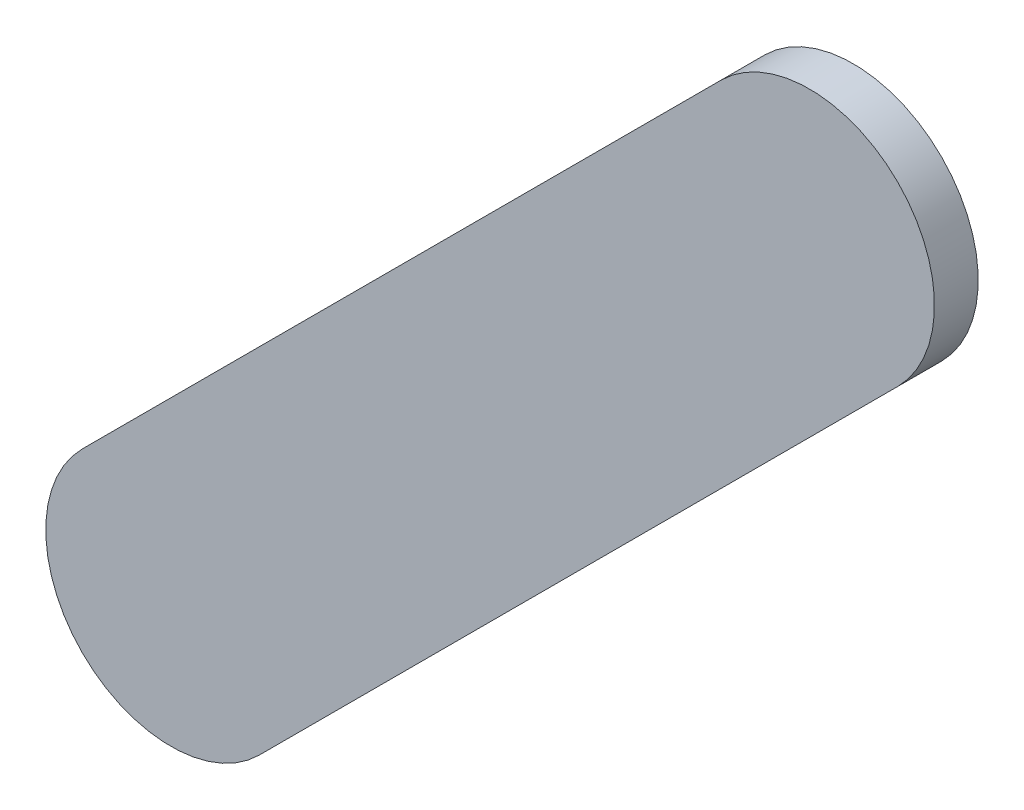
ISO-10303-21;
HEADER;
FILE_DESCRIPTION(('STEP AP214'),'2;1');
FILE_NAME('part.step','',(''),(''),'','','');
FILE_SCHEMA(('AUTOMOTIVE_DESIGN { 1 0 10303 214 1 1 1 1 }'));
ENDSEC;
DATA;
#1=APPLICATION_CONTEXT('core data for automotive mechanical design processes');
#2=APPLICATION_PROTOCOL_DEFINITION('international standard','automotive_design',2000,#1);
#3=PRODUCT_CONTEXT('',#1,'mechanical');
#4=PRODUCT('Part','Part','',(#3));
#5=PRODUCT_RELATED_PRODUCT_CATEGORY('part','',(#4));
#6=PRODUCT_DEFINITION_FORMATION('','',#4);
#7=PRODUCT_DEFINITION_CONTEXT('part definition',#1,'design');
#8=PRODUCT_DEFINITION('design','',#6,#7);
#9=PRODUCT_DEFINITION_SHAPE('','',#8);
#10=(LENGTH_UNIT() NAMED_UNIT(*) SI_UNIT(.MILLI.,.METRE.));
#11=(NAMED_UNIT(*) PLANE_ANGLE_UNIT() SI_UNIT($,.RADIAN.));
#12=(NAMED_UNIT(*) SI_UNIT($,.STERADIAN.) SOLID_ANGLE_UNIT());
#13=UNCERTAINTY_MEASURE_WITH_UNIT(LENGTH_MEASURE(1.E-05),#10,'distance_accuracy_value','');
#14=(GEOMETRIC_REPRESENTATION_CONTEXT(3) GLOBAL_UNCERTAINTY_ASSIGNED_CONTEXT((#13)) GLOBAL_UNIT_ASSIGNED_CONTEXT((#10,
#11,#12)) REPRESENTATION_CONTEXT('',''));
#15=CARTESIAN_POINT('',(0.,0.,0.));
#16=DIRECTION('',(0.,0.,1.));
#17=DIRECTION('',(1.,0.,0.));
#18=AXIS2_PLACEMENT_3D('',#15,#16,#17);
#19=CARTESIAN_POINT('',(89.734949,-132.27071,1.635));
#20=DIRECTION('',(0.,0.,1.));
#21=DIRECTION('',(1.,0.,0.));
#22=AXIS2_PLACEMENT_3D('',#19,#20,#21);
#23=PLANE('',#22);
#24=DIRECTION('',(0.707106781186548,0.707106781186548,0.));
#25=VECTOR('',#24,1.);
#26=CARTESIAN_POINT('',(89.734949,-132.27071,1.635));
#27=LINE('',#26,#25);
#28=CARTESIAN_POINT('',(89.734949,-132.27071,1.635));
#29=VERTEX_POINT('',#28);
#30=CARTESIAN_POINT('',(90.24571,-131.759949,1.635));
#31=VERTEX_POINT('',#30);
#32=EDGE_CURVE('E79',#29,#31,#27,.T.);
#33=ORIENTED_EDGE('',*,*,#32,.T.);
#34=CARTESIAN_POINT('',(90.1749995,-131.6892385,1.635));
#35=DIRECTION('',(0.,0.,1.));
#36=DIRECTION('',(0.707106781186048,-0.707106781187047,0.));
#37=AXIS2_PLACEMENT_3D('',#34,#35,#36);
#38=CIRCLE('',#37,0.09999974810219);
#39=CARTESIAN_POINT('',(90.104289,-131.618528,1.635));
#40=VERTEX_POINT('',#39);
#41=EDGE_CURVE('E77',#31,#40,#38,.T.);
#42=ORIENTED_EDGE('',*,*,#41,.T.);
#43=DIRECTION('',(-0.707106781186548,-0.707106781186548,0.));
#44=VECTOR('',#43,1.);
#45=CARTESIAN_POINT('',(90.104289,-131.618528,1.635));
#46=LINE('',#45,#44);
#47=CARTESIAN_POINT('',(89.593528,-132.129289,1.635));
#48=VERTEX_POINT('',#47);
#49=EDGE_CURVE('E65',#40,#48,#46,.T.);
#50=ORIENTED_EDGE('',*,*,#49,.T.);
#51=CARTESIAN_POINT('',(89.6642385,-132.1999995,1.635));
#52=DIRECTION('',(0.,0.,1.));
#53=DIRECTION('',(-0.707106781187047,0.707106781186048,0.));
#54=AXIS2_PLACEMENT_3D('',#51,#52,#53);
#55=CIRCLE('',#54,0.09999974810219);
#56=EDGE_CURVE('E11',#48,#29,#55,.T.);
#57=ORIENTED_EDGE('',*,*,#56,.T.);
#58=EDGE_LOOP('',(#33,#42,#50,#57));
#59=FACE_BOUND('',#58,.T.);
#60=ADVANCED_FACE('F17',(#59),#23,.T.);
#61=CARTESIAN_POINT('',(89.734949,-132.27071,1.6));
#62=DIRECTION('',(0.,0.,1.));
#63=DIRECTION('',(1.,0.,0.));
#64=AXIS2_PLACEMENT_3D('',#61,#62,#63);
#65=PLANE('',#64);
#66=CARTESIAN_POINT('',(89.6642385,-132.1999995,1.6));
#67=DIRECTION('',(0.,0.,1.));
#68=DIRECTION('',(-0.707106781187047,0.707106781186048,0.));
#69=AXIS2_PLACEMENT_3D('',#66,#67,#68);
#70=CIRCLE('',#69,0.09999974810219);
#71=CARTESIAN_POINT('',(89.593528,-132.129289,1.6));
#72=VERTEX_POINT('',#71);
#73=CARTESIAN_POINT('',(89.734949,-132.27071,1.6));
#74=VERTEX_POINT('',#73);
#75=EDGE_CURVE('E26',#72,#74,#70,.T.);
#76=ORIENTED_EDGE('',*,*,#75,.F.);
#77=DIRECTION('',(-0.707106781186548,-0.707106781186548,0.));
#78=VECTOR('',#77,1.);
#79=CARTESIAN_POINT('',(90.104289,-131.618528,1.6));
#80=LINE('',#79,#78);
#81=CARTESIAN_POINT('',(90.104289,-131.618528,1.6));
#82=VERTEX_POINT('',#81);
#83=EDGE_CURVE('E84',#82,#72,#80,.T.);
#84=ORIENTED_EDGE('',*,*,#83,.F.);
#85=CARTESIAN_POINT('',(90.1749995,-131.6892385,1.6));
#86=DIRECTION('',(0.,0.,1.));
#87=DIRECTION('',(0.707106781186048,-0.707106781187047,0.));
#88=AXIS2_PLACEMENT_3D('',#85,#86,#87);
#89=CIRCLE('',#88,0.09999974810219);
#90=CARTESIAN_POINT('',(90.24571,-131.759949,1.6));
#91=VERTEX_POINT('',#90);
#92=EDGE_CURVE('E87',#91,#82,#89,.T.);
#93=ORIENTED_EDGE('',*,*,#92,.F.);
#94=DIRECTION('',(0.707106781186548,0.707106781186548,0.));
#95=VECTOR('',#94,1.);
#96=CARTESIAN_POINT('',(89.734949,-132.27071,1.6));
#97=LINE('',#96,#95);
#98=EDGE_CURVE('E118',#74,#91,#97,.T.);
#99=ORIENTED_EDGE('',*,*,#98,.F.);
#100=EDGE_LOOP('',(#76,#84,#93,#99));
#101=FACE_BOUND('',#100,.T.);
#102=ADVANCED_FACE('F151',(#101),#65,.F.);
#103=CARTESIAN_POINT('',(89.6642385,-132.1999995,1.6));
#104=DIRECTION('',(0.,0.,-1.));
#105=DIRECTION('',(-0.707106781187048,0.707106781186048,0.));
#106=AXIS2_PLACEMENT_3D('',#103,#104,#105);
#107=CYLINDRICAL_SURFACE('',#106,0.09999974810219);
#108=ORIENTED_EDGE('',*,*,#75,.T.);
#109=DIRECTION('',(0.,0.,1.));
#110=VECTOR('',#109,1.);
#111=CARTESIAN_POINT('',(89.734949,-132.27071,1.6));
#112=LINE('',#111,#110);
#113=EDGE_CURVE('E94',#74,#29,#112,.T.);
#114=ORIENTED_EDGE('',*,*,#113,.T.);
#115=ORIENTED_EDGE('',*,*,#56,.F.);
#116=DIRECTION('',(0.,0.,1.));
#117=VECTOR('',#116,1.);
#118=CARTESIAN_POINT('',(89.593528,-132.129289,1.6));
#119=LINE('',#118,#117);
#120=EDGE_CURVE('E72',#72,#48,#119,.T.);
#121=ORIENTED_EDGE('',*,*,#120,.F.);
#122=EDGE_LOOP('',(#108,#114,#115,#121));
#123=FACE_BOUND('',#122,.T.);
#124=ADVANCED_FACE('F146',(#123),#107,.T.);
#125=CARTESIAN_POINT('',(90.104289,-131.618528,1.6));
#126=DIRECTION('',(0.707106781186548,-0.707106781186548,0.));
#127=DIRECTION('',(0.,0.,-1.));
#128=AXIS2_PLACEMENT_3D('',#125,#126,#127);
#129=PLANE('',#128);
#130=ORIENTED_EDGE('',*,*,#83,.T.);
#131=ORIENTED_EDGE('',*,*,#120,.T.);
#132=ORIENTED_EDGE('',*,*,#49,.F.);
#133=DIRECTION('',(0.,0.,1.));
#134=VECTOR('',#133,1.);
#135=CARTESIAN_POINT('',(90.104289,-131.618528,1.6));
#136=LINE('',#135,#134);
#137=EDGE_CURVE('E70',#82,#40,#136,.T.);
#138=ORIENTED_EDGE('',*,*,#137,.F.);
#139=EDGE_LOOP('',(#130,#131,#132,#138));
#140=FACE_BOUND('',#139,.T.);
#141=ADVANCED_FACE('F68',(#140),#129,.F.);
#142=CARTESIAN_POINT('',(90.1749995,-131.6892385,1.6));
#143=DIRECTION('',(0.,0.,-1.));
#144=DIRECTION('',(0.707106781186048,-0.707106781187048,0.));
#145=AXIS2_PLACEMENT_3D('',#142,#143,#144);
#146=CYLINDRICAL_SURFACE('',#145,0.09999974810219);
#147=ORIENTED_EDGE('',*,*,#92,.T.);
#148=ORIENTED_EDGE('',*,*,#137,.T.);
#149=ORIENTED_EDGE('',*,*,#41,.F.);
#150=DIRECTION('',(0.,0.,1.));
#151=VECTOR('',#150,1.);
#152=CARTESIAN_POINT('',(90.24571,-131.759949,1.6));
#153=LINE('',#152,#151);
#154=EDGE_CURVE('E122',#91,#31,#153,.T.);
#155=ORIENTED_EDGE('',*,*,#154,.F.);
#156=EDGE_LOOP('',(#147,#148,#149,#155));
#157=FACE_BOUND('',#156,.T.);
#158=ADVANCED_FACE('F86',(#157),#146,.T.);
#159=CARTESIAN_POINT('',(89.734949,-132.27071,1.6));
#160=DIRECTION('',(-0.707106781186548,0.707106781186548,0.));
#161=DIRECTION('',(0.,0.,1.));
#162=AXIS2_PLACEMENT_3D('',#159,#160,#161);
#163=PLANE('',#162);
#164=ORIENTED_EDGE('',*,*,#98,.T.);
#165=ORIENTED_EDGE('',*,*,#154,.T.);
#166=ORIENTED_EDGE('',*,*,#32,.F.);
#167=ORIENTED_EDGE('',*,*,#113,.F.);
#168=EDGE_LOOP('',(#164,#165,#166,#167));
#169=FACE_BOUND('',#168,.T.);
#170=ADVANCED_FACE('F150',(#169),#163,.F.);
#171=CLOSED_SHELL('',(#60,#102,#124,#141,#158,#170));
#172=MANIFOLD_SOLID_BREP('B1',#171);
#173=ADVANCED_BREP_SHAPE_REPRESENTATION('',(#18,#172),#14);
#174=SHAPE_DEFINITION_REPRESENTATION(#9,#173);
ENDSEC;
END-ISO-10303-21;
